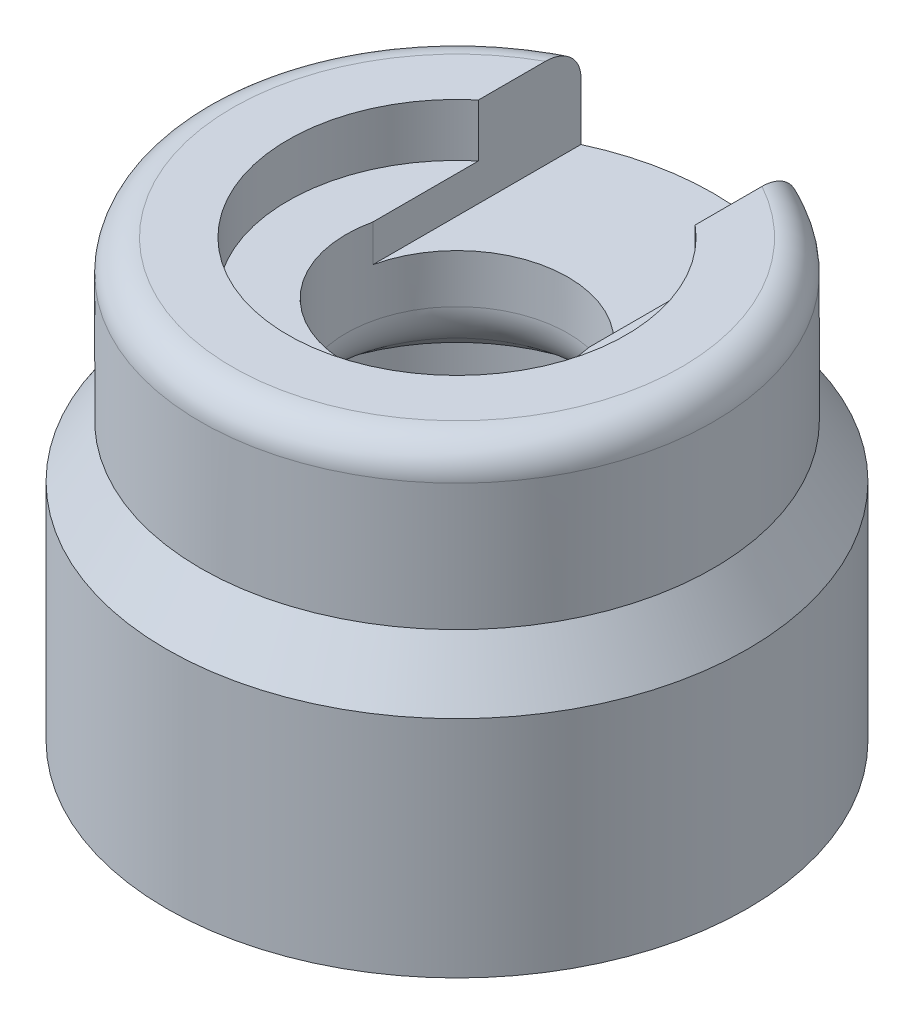
ISO-10303-21;
HEADER;
FILE_DESCRIPTION(('STEP AP214'),'2;1');
FILE_NAME('part.step','',(''),(''),'','','');
FILE_SCHEMA(('AUTOMOTIVE_DESIGN { 1 0 10303 214 1 1 1 1 }'));
ENDSEC;
DATA;
#1=APPLICATION_CONTEXT('core data for automotive mechanical design processes');
#2=APPLICATION_PROTOCOL_DEFINITION('international standard','automotive_design',2000,#1);
#3=PRODUCT_CONTEXT('',#1,'mechanical');
#4=PRODUCT('Part','Part','',(#3));
#5=PRODUCT_RELATED_PRODUCT_CATEGORY('part','',(#4));
#6=PRODUCT_DEFINITION_FORMATION('','',#4);
#7=PRODUCT_DEFINITION_CONTEXT('part definition',#1,'design');
#8=PRODUCT_DEFINITION('design','',#6,#7);
#9=PRODUCT_DEFINITION_SHAPE('','',#8);
#10=(LENGTH_UNIT() NAMED_UNIT(*) SI_UNIT(.MILLI.,.METRE.));
#11=(NAMED_UNIT(*) PLANE_ANGLE_UNIT() SI_UNIT($,.RADIAN.));
#12=(NAMED_UNIT(*) SI_UNIT($,.STERADIAN.) SOLID_ANGLE_UNIT());
#13=UNCERTAINTY_MEASURE_WITH_UNIT(LENGTH_MEASURE(1.E-05),#10,'distance_accuracy_value','');
#14=(GEOMETRIC_REPRESENTATION_CONTEXT(3) GLOBAL_UNCERTAINTY_ASSIGNED_CONTEXT((#13)) GLOBAL_UNIT_ASSIGNED_CONTEXT((#10,
#11,#12)) REPRESENTATION_CONTEXT('',''));
#15=CARTESIAN_POINT('',(0.,0.,0.));
#16=DIRECTION('',(0.,0.,1.));
#17=DIRECTION('',(1.,0.,0.));
#18=AXIS2_PLACEMENT_3D('',#15,#16,#17);
#19=CARTESIAN_POINT('',(0.,0.,0.));
#20=DIRECTION('',(0.,-1.,0.));
#21=DIRECTION('',(0.,0.,-1.));
#22=AXIS2_PLACEMENT_3D('',#19,#20,#21);
#23=CYLINDRICAL_SURFACE('',#22,2.1);
#24=CARTESIAN_POINT('',(0.,5.63062484748657,0.));
#25=DIRECTION('',(0.,1.,0.));
#26=DIRECTION('',(0.,0.,1.));
#27=AXIS2_PLACEMENT_3D('',#24,#25,#26);
#28=CIRCLE('',#27,2.1);
#29=CARTESIAN_POINT('',(0.,5.63062484748657,2.1));
#30=VERTEX_POINT('',#29);
#31=EDGE_CURVE('E152',#30,#30,#28,.F.);
#32=ORIENTED_EDGE('',*,*,#31,.T.);
#33=EDGE_LOOP('',(#32));
#34=FACE_BOUND('',#33,.T.);
#35=DIRECTION('',(0.,-1.,0.));
#36=VECTOR('',#35,1.);
#37=CARTESIAN_POINT('',(-2.05,0.,-0.455521678957217));
#38=LINE('',#37,#36);
#39=CARTESIAN_POINT('',(-2.05,7.25,-0.455521678957217));
#40=VERTEX_POINT('',#39);
#41=CARTESIAN_POINT('',(-2.05,6.55,-0.455521678957217));
#42=VERTEX_POINT('',#41);
#43=EDGE_CURVE('E107',#40,#42,#38,.T.);
#44=ORIENTED_EDGE('',*,*,#43,.F.);
#45=CARTESIAN_POINT('',(0.,7.25,0.));
#46=DIRECTION('',(0.,1.,0.));
#47=DIRECTION('',(0.,0.,1.));
#48=AXIS2_PLACEMENT_3D('',#45,#46,#47);
#49=CIRCLE('',#48,2.1);
#50=CARTESIAN_POINT('',(2.05,7.25,-0.455521678957217));
#51=VERTEX_POINT('',#50);
#52=EDGE_CURVE('E137',#51,#40,#49,.F.);
#53=ORIENTED_EDGE('',*,*,#52,.F.);
#54=DIRECTION('',(0.,-1.,0.));
#55=VECTOR('',#54,1.);
#56=CARTESIAN_POINT('',(2.05,0.,-0.455521678957217));
#57=LINE('',#56,#55);
#58=CARTESIAN_POINT('',(2.05,6.55,-0.455521678957217));
#59=VERTEX_POINT('',#58);
#60=EDGE_CURVE('E287',#59,#51,#57,.F.);
#61=ORIENTED_EDGE('',*,*,#60,.F.);
#62=CARTESIAN_POINT('',(0.,6.55,0.));
#63=DIRECTION('',(0.,-1.,0.));
#64=DIRECTION('',(0.,0.,-1.));
#65=AXIS2_PLACEMENT_3D('',#62,#63,#64);
#66=CIRCLE('',#65,2.1);
#67=EDGE_CURVE('E242',#59,#42,#66,.F.);
#68=ORIENTED_EDGE('',*,*,#67,.T.);
#69=EDGE_LOOP('',(#44,#53,#61,#68));
#70=FACE_BOUND('',#69,.T.);
#71=ADVANCED_FACE('F39',(#34,#70),#23,.F.);
#72=CARTESIAN_POINT('',(0.,8.25,0.));
#73=DIRECTION('',(0.,1.,0.));
#74=DIRECTION('',(0.,0.,1.));
#75=AXIS2_PLACEMENT_3D('',#72,#73,#74);
#76=PLANE('',#75);
#77=CARTESIAN_POINT('',(0.,8.25,0.));
#78=DIRECTION('',(0.,1.,0.));
#79=DIRECTION('',(0.,0.,1.));
#80=AXIS2_PLACEMENT_3D('',#77,#78,#79);
#81=CIRCLE('',#80,3.2);
#82=CARTESIAN_POINT('',(-2.05,8.25,-2.45713247506112));
#83=VERTEX_POINT('',#82);
#84=CARTESIAN_POINT('',(2.05,8.25,-2.45713247506112));
#85=VERTEX_POINT('',#84);
#86=EDGE_CURVE('E116',#83,#85,#81,.T.);
#87=ORIENTED_EDGE('',*,*,#86,.F.);
#88=DIRECTION('',(0.,0.,1.));
#89=VECTOR('',#88,1.);
#90=CARTESIAN_POINT('',(-2.05,8.25,-0.00307043052494294));
#91=LINE('',#90,#89);
#92=CARTESIAN_POINT('',(-2.05,8.25,-3.72290209379726));
#93=VERTEX_POINT('',#92);
#94=EDGE_CURVE('E100',#93,#83,#91,.T.);
#95=ORIENTED_EDGE('',*,*,#94,.F.);
#96=CARTESIAN_POINT('',(0.,8.25,0.));
#97=DIRECTION('',(0.,1.,0.));
#98=DIRECTION('',(0.,0.,1.));
#99=AXIS2_PLACEMENT_3D('',#96,#97,#98);
#100=CIRCLE('',#99,4.25);
#101=CARTESIAN_POINT('',(2.05,8.25,-3.72290209379726));
#102=VERTEX_POINT('',#101);
#103=EDGE_CURVE('E114',#93,#102,#100,.T.);
#104=ORIENTED_EDGE('',*,*,#103,.T.);
#105=DIRECTION('',(0.,0.,-1.));
#106=VECTOR('',#105,1.);
#107=CARTESIAN_POINT('',(2.05,8.25,-0.00307043052494294));
#108=LINE('',#107,#106);
#109=EDGE_CURVE('E118',#85,#102,#108,.T.);
#110=ORIENTED_EDGE('',*,*,#109,.F.);
#111=EDGE_LOOP('',(#87,#95,#104,#110));
#112=FACE_BOUND('',#111,.T.);
#113=ADVANCED_FACE('F112',(#112),#76,.T.);
#114=CARTESIAN_POINT('',(0.,8.25,0.));
#115=DIRECTION('',(0.,-1.,0.));
#116=DIRECTION('',(0.,0.,-1.));
#117=AXIS2_PLACEMENT_3D('',#114,#115,#116);
#118=CYLINDRICAL_SURFACE('',#117,4.85);
#119=CARTESIAN_POINT('',(0.,5.25,0.));
#120=DIRECTION('',(0.,1.,0.));
#121=DIRECTION('',(0.,0.,1.));
#122=AXIS2_PLACEMENT_3D('',#119,#120,#121);
#123=CIRCLE('',#122,4.85);
#124=CARTESIAN_POINT('',(0.,5.25,4.85));
#125=VERTEX_POINT('',#124);
#126=EDGE_CURVE('E141',#125,#125,#123,.T.);
#127=ORIENTED_EDGE('',*,*,#126,.T.);
#128=EDGE_LOOP('',(#127));
#129=FACE_BOUND('',#128,.T.);
#130=DIRECTION('',(0.,-1.,0.));
#131=VECTOR('',#130,1.);
#132=CARTESIAN_POINT('',(-2.05,8.25,-4.39545219516718));
#133=LINE('',#132,#131);
#134=CARTESIAN_POINT('',(-2.05,6.55,-4.39545219516718));
#135=VERTEX_POINT('',#134);
#136=CARTESIAN_POINT('',(-2.05,7.65,-4.39545219516718));
#137=VERTEX_POINT('',#136);
#138=EDGE_CURVE('E63',#135,#137,#133,.F.);
#139=ORIENTED_EDGE('',*,*,#138,.F.);
#140=CARTESIAN_POINT('',(0.,6.55,0.));
#141=DIRECTION('',(0.,-1.,0.));
#142=DIRECTION('',(0.,0.,-1.));
#143=AXIS2_PLACEMENT_3D('',#140,#141,#142);
#144=CIRCLE('',#143,4.85);
#145=CARTESIAN_POINT('',(2.05,6.55,-4.39545219516718));
#146=VERTEX_POINT('',#145);
#147=EDGE_CURVE('E148',#135,#146,#144,.T.);
#148=ORIENTED_EDGE('',*,*,#147,.T.);
#149=DIRECTION('',(0.,-1.,0.));
#150=VECTOR('',#149,1.);
#151=CARTESIAN_POINT('',(2.05,8.25,-4.39545219516718));
#152=LINE('',#151,#150);
#153=CARTESIAN_POINT('',(2.05,7.65000000000141,-4.39545219517171));
#154=VERTEX_POINT('',#153);
#155=EDGE_CURVE('E290',#154,#146,#152,.T.);
#156=ORIENTED_EDGE('',*,*,#155,.F.);
#157=CARTESIAN_POINT('',(0.,7.65,0.));
#158=DIRECTION('',(0.,1.,0.));
#159=DIRECTION('',(0.,0.,1.));
#160=AXIS2_PLACEMENT_3D('',#157,#158,#159);
#161=CIRCLE('',#160,4.85);
#162=EDGE_CURVE('E125',#154,#137,#161,.F.);
#163=ORIENTED_EDGE('',*,*,#162,.T.);
#164=EDGE_LOOP('',(#139,#148,#156,#163));
#165=FACE_BOUND('',#164,.T.);
#166=ADVANCED_FACE('F181',(#129,#165),#118,.T.);
#167=CARTESIAN_POINT('',(0.,7.65,0.));
#168=DIRECTION('',(0.,1.,0.));
#169=DIRECTION('',(0.,0.,1.));
#170=AXIS2_PLACEMENT_3D('',#167,#168,#169);
#171=TOROIDAL_SURFACE('',#170,4.25,0.6);
#172=ORIENTED_EDGE('',*,*,#103,.F.);
#173=CARTESIAN_POINT('',(-2.05,7.82702656765355,-4.3659624204099));
#174=CARTESIAN_POINT('',(-2.05,7.79789616420382,-4.37589958519883));
#175=CARTESIAN_POINT('',(-2.05,7.7679347321462,-4.38341858156068));
#176=CARTESIAN_POINT('',(-2.05,7.70716617375585,-4.39331166687076));
#177=CARTESIAN_POINT('',(-2.05,7.67635890080707,-4.39568485808263));
#178=CARTESIAN_POINT('',(-2.05,7.61478308067573,-4.39518345726772));
#179=CARTESIAN_POINT('',(-2.05,7.58401453883898,-4.39230820655039));
#180=CARTESIAN_POINT('',(-2.05,7.52340193468848,-4.38143035030518));
#181=CARTESIAN_POINT('',(-2.05,7.49355787578409,-4.37342772587065));
#182=CARTESIAN_POINT('',(-2.05,7.43557905794428,-4.35261248719747));
#183=CARTESIAN_POINT('',(-2.05,7.4074456215855,-4.33979620484376));
#184=CARTESIAN_POINT('',(-2.05,7.35359202055706,-4.30983848154537));
#185=CARTESIAN_POINT('',(-2.05,7.32787221595421,-4.29269639667799));
#186=CARTESIAN_POINT('',(-2.05,7.27816405898177,-4.2537183090096));
#187=CARTESIAN_POINT('',(-2.05,7.25432636381237,-4.23169061442462));
#188=CARTESIAN_POINT('',(-2.05,7.21032616660067,-4.18423574651145));
#189=CARTESIAN_POINT('',(-2.05,7.19016486124239,-4.15880747092846));
#190=CARTESIAN_POINT('',(-2.05,7.1521909904352,-4.10292509906765));
#191=CARTESIAN_POINT('',(-2.05,7.13473973763256,-4.07222578945374));
#192=CARTESIAN_POINT('',(-2.05,7.10467810415964,-4.00854754961368));
#193=CARTESIAN_POINT('',(-2.05,7.09206973737342,-3.97556767774238));
#194=CARTESIAN_POINT('',(-2.05,7.07066861067594,-3.9045792712337));
#195=CARTESIAN_POINT('',(-2.05,7.06241825476747,-3.86640714494793));
#196=CARTESIAN_POINT('',(-2.05,7.05183749056033,-3.78925367539485));
#197=CARTESIAN_POINT('',(-2.05,7.0495094947644,-3.75027200887392));
#198=CARTESIAN_POINT('',(-2.05,7.05071588732587,-3.6687219188476));
#199=CARTESIAN_POINT('',(-2.05,7.05482278012077,-3.6261612997214));
#200=CARTESIAN_POINT('',(-2.05,7.06981696602189,-3.54222647356126));
#201=CARTESIAN_POINT('',(-2.05,7.08070885536849,-3.50085309066589));
#202=CARTESIAN_POINT('',(-2.05,7.10969160320318,-3.41874697533617));
#203=CARTESIAN_POINT('',(-2.05,7.12806330977758,-3.37811263590838));
#204=CARTESIAN_POINT('',(-2.05,7.17176396920776,-3.30077634383149));
#205=CARTESIAN_POINT('',(-2.05,7.19708547483925,-3.26407023997886));
#206=CARTESIAN_POINT('',(-2.05,7.24801957741552,-3.20373637431564));
#207=CARTESIAN_POINT('',(-2.05,7.27233395711084,-3.17901028512039));
#208=CARTESIAN_POINT('',(-2.05,7.32470733103949,-3.13387637278035));
#209=CARTESIAN_POINT('',(-2.05,7.35276444311836,-3.11346639239095));
#210=CARTESIAN_POINT('',(-2.05,7.41234971583042,-3.07786335533166));
#211=CARTESIAN_POINT('',(-2.05,7.44390341388455,-3.06271254328679));
#212=CARTESIAN_POINT('',(-2.05,7.50937765377983,-3.03891481103632));
#213=CARTESIAN_POINT('',(-2.05,7.5432955525543,-3.03026075127402));
#214=CARTESIAN_POINT('',(-2.05,7.60742884776183,-3.02085772894982));
#215=CARTESIAN_POINT('',(-2.05,7.63751048299831,-3.01918386797632));
#216=CARTESIAN_POINT('',(-2.05,7.6974752822644,-3.02130020750095));
#217=CARTESIAN_POINT('',(-2.05,7.72735850860811,-3.02508860215133));
#218=CARTESIAN_POINT('',(-2.05,7.7840594118198,-3.03745077956584));
#219=CARTESIAN_POINT('',(-2.05,7.81094997157599,-3.04569672945288));
#220=CARTESIAN_POINT('',(-2.05,7.86309971812131,-3.06629617782491));
#221=CARTESIAN_POINT('',(-2.05,7.88835861053544,-3.07865041504282));
#222=CARTESIAN_POINT('',(-2.05,7.93847488659082,-3.10791279131869));
#223=CARTESIAN_POINT('',(-2.05,7.96318090363088,-3.1250788031759));
#224=CARTESIAN_POINT('',(-2.05,8.00983739260526,-3.16280725584708));
#225=CARTESIAN_POINT('',(-2.05,8.03178653735467,-3.18337132157021));
#226=CARTESIAN_POINT('',(-2.05,8.0757708215901,-3.23054659082279));
#227=CARTESIAN_POINT('',(-2.05,8.09732884043481,-3.25760223855464));
#228=CARTESIAN_POINT('',(-2.05,8.13632888681062,-3.31452887400689));
#229=CARTESIAN_POINT('',(-2.05,8.15376847838147,-3.34440151337395));
#230=CARTESIAN_POINT('',(-2.05,8.18681520332177,-3.41110286884268));
#231=CARTESIAN_POINT('',(-2.05,8.20170579942668,-3.44828769849733));
#232=CARTESIAN_POINT('',(-2.05,8.22566473847258,-3.52449255936302));
#233=CARTESIAN_POINT('',(-2.05,8.23472998466301,-3.56351355486919));
#234=CARTESIAN_POINT('',(-2.05,8.24747375800465,-3.64631759223002));
#235=CARTESIAN_POINT('',(-2.05,8.25054509319164,-3.69019564533298));
#236=CARTESIAN_POINT('',(-2.05,8.24929645733402,-3.77786178903724));
#237=CARTESIAN_POINT('',(-2.05,8.24497509273001,-3.8216498611188));
#238=CARTESIAN_POINT('',(-2.05,8.22878540960025,-3.90784001113535));
#239=CARTESIAN_POINT('',(-2.05,8.21691523726177,-3.95024174592789));
#240=CARTESIAN_POINT('',(-2.05,8.18559209233744,-4.03217134846679));
#241=CARTESIAN_POINT('',(-2.05,8.16614141255357,-4.07170008089689));
#242=CARTESIAN_POINT('',(-2.05,8.12178987967923,-4.14316566859015));
#243=CARTESIAN_POINT('',(-2.05,8.09746497552256,-4.17545903998858));
#244=CARTESIAN_POINT('',(-2.05,8.04310817933888,-4.23479624131825));
#245=CARTESIAN_POINT('',(-2.05,8.01308602534007,-4.26184887182379));
#246=CARTESIAN_POINT('',(-2.05,7.9572485946442,-4.30273543456146));
#247=CARTESIAN_POINT('',(-2.05,7.93258099963404,-4.3181538716295));
#248=CARTESIAN_POINT('',(-2.05,7.88119660508023,-4.3450838961169));
#249=CARTESIAN_POINT('',(-2.05,7.85448065488254,-4.35659709220924));
#250=CARTESIAN_POINT('',(-2.05,7.82702656765355,-4.3659624204099));
#251=B_SPLINE_CURVE_WITH_KNOTS('',3,(#173,#174,#175,#176,#177,#178,#179,#180,#181,#182,#183,
#184,#185,#186,#187,#188,#189,#190,#191,#192,#193,#194,#195,#196,#197,#198,#199,#200,#201,#202,
#203,#204,#205,#206,#207,#208,#209,#210,#211,#212,#213,#214,#215,#216,#217,#218,#219,#220,#221,
#222,#223,#224,#225,#226,#227,#228,#229,#230,#231,#232,#233,#234,#235,#236,#237,#238,#239,#240,
#241,#242,#243,#244,#245,#246,#247,#248,#249,#250),.UNSPECIFIED.,.T.,.F.,(4,2,2,2,2,2,2,2,2,2,2,
2,2,2,2,2,2,2,2,2,2,2,2,2,2,2,2,2,2,2,2,2,2,2,2,2,2,2,4),(0.,0.0922353657705963,
0.184486821614483,0.276749856006947,0.369013230611486,0.46134705508787,0.55369463214644,
0.650654974637119,0.747646822103546,0.853149167204813,0.958695337424861,1.0753688565956,
1.19208989569759,1.3197988330454,1.44759437622078,1.58071068286834,1.71368489873564,
1.81730473615466,1.92087266004515,2.02525422916093,2.12952092034462,2.21942142614593,
2.30929221722536,2.39330818307341,2.47733926445436,2.56724168075667,2.65718721240428,
2.76057137692834,2.86401653863454,2.98368804723432,3.10342312058244,3.23476219466188,
3.36612602951566,3.49752213675523,3.6288785327029,3.74949034689628,3.86989783244441,
3.95686135766385,4.04378901665884),.UNSPECIFIED.);
#252=EDGE_CURVE('E97',#93,#137,#251,.T.);
#253=ORIENTED_EDGE('',*,*,#252,.T.);
#254=ORIENTED_EDGE('',*,*,#162,.F.);
#255=CARTESIAN_POINT('',(2.05,7.82702656765355,-4.3659624204099));
#256=CARTESIAN_POINT('',(2.05,7.85845116373127,-4.35524020156051));
#257=CARTESIAN_POINT('',(2.05,7.88893845091345,-4.34169321240446));
#258=CARTESIAN_POINT('',(2.05,7.94714299271204,-4.30953875746112));
#259=CARTESIAN_POINT('',(2.05,7.97485594961202,-4.29092360154361));
#260=CARTESIAN_POINT('',(2.05,8.02671756652584,-4.24945701674648));
#261=CARTESIAN_POINT('',(2.05,8.0508795173142,-4.22662214600511));
#262=CARTESIAN_POINT('',(2.05,8.09530863566426,-4.17746104492432));
#263=CARTESIAN_POINT('',(2.05,8.11557635027492,-4.15113530584955));
#264=CARTESIAN_POINT('',(2.05,8.15316965912072,-4.09391129103401));
#265=CARTESIAN_POINT('',(2.05,8.17020849778071,-4.06282508227916));
#266=CARTESIAN_POINT('',(2.05,8.19939880287093,-3.99844071247992));
#267=CARTESIAN_POINT('',(2.05,8.2115481256459,-3.96514158869005));
#268=CARTESIAN_POINT('',(2.05,8.23195568945314,-3.8935105162487));
#269=CARTESIAN_POINT('',(2.05,8.23966023996694,-3.85502073391044));
#270=CARTESIAN_POINT('',(2.05,8.24909860517074,-3.77731784681239));
#271=CARTESIAN_POINT('',(2.05,8.25082993862605,-3.73810444826529));
#272=CARTESIAN_POINT('',(2.05,8.24832825530129,-3.65622876947952));
#273=CARTESIAN_POINT('',(2.05,8.24352851931522,-3.61358311034281));
#274=CARTESIAN_POINT('',(2.05,8.22711678111371,-3.52959665990672));
#275=CARTESIAN_POINT('',(2.05,8.2155001644249,-3.48825677250346));
#276=CARTESIAN_POINT('',(2.05,8.18506654930002,-3.40651943516512));
#277=CARTESIAN_POINT('',(2.05,8.16599485281074,-3.3662161134218));
#278=CARTESIAN_POINT('',(2.05,8.12092128162532,-3.28969304730218));
#279=CARTESIAN_POINT('',(2.05,8.09492740134261,-3.25346866040708));
#280=CARTESIAN_POINT('',(2.05,8.04306821630167,-3.19441327883802));
#281=CARTESIAN_POINT('',(2.05,8.01853091975604,-3.17041330156966));
#282=CARTESIAN_POINT('',(2.05,7.96583405362623,-3.1267605753272));
#283=CARTESIAN_POINT('',(2.05,7.93767645117678,-3.1071054811676));
#284=CARTESIAN_POINT('',(2.05,7.87803453389167,-3.07302342075311));
#285=CARTESIAN_POINT('',(2.05,7.84652627979598,-3.05863786312627));
#286=CARTESIAN_POINT('',(2.05,7.78129862384408,-3.03632152240065));
#287=CARTESIAN_POINT('',(2.05,7.74758155114276,-3.02838405464636));
#288=CARTESIAN_POINT('',(2.05,7.68384766224499,-3.02019618700633));
#289=CARTESIAN_POINT('',(2.05,7.65394336373204,-3.01905520690333));
#290=CARTESIAN_POINT('',(2.05,7.5944207986256,-3.02215564006646));
#291=CARTESIAN_POINT('',(2.05,7.56480245275124,-3.02639551562656));
#292=CARTESIAN_POINT('',(2.05,7.50847570039741,-3.03957444071362));
#293=CARTESIAN_POINT('',(2.05,7.4816984009286,-3.04822429349773));
#294=CARTESIAN_POINT('',(2.05,7.42982675650259,-3.06958827697445));
#295=CARTESIAN_POINT('',(2.05,7.4047327402929,-3.08230319880087));
#296=CARTESIAN_POINT('',(2.05,7.35487061566852,-3.11233643319897));
#297=CARTESIAN_POINT('',(2.05,7.33026827950996,-3.12992859416607));
#298=CARTESIAN_POINT('',(2.05,7.28387400414938,-3.16848393771036));
#299=CARTESIAN_POINT('',(2.05,7.26208344866614,-3.18944876871293));
#300=CARTESIAN_POINT('',(2.05,7.21845216698128,-3.23749757120448));
#301=CARTESIAN_POINT('',(2.05,7.19710285338653,-3.2650274420099));
#302=CARTESIAN_POINT('',(2.05,7.15859139070635,-3.32287070701234));
#303=CARTESIAN_POINT('',(2.05,7.14143171608565,-3.3531857316884));
#304=CARTESIAN_POINT('',(2.05,7.10908496841692,-3.42075821486627));
#305=CARTESIAN_POINT('',(2.05,7.09461943503448,-3.4583622394865));
#306=CARTESIAN_POINT('',(2.05,7.07159240315678,-3.53534162202768));
#307=CARTESIAN_POINT('',(2.05,7.06303400575422,-3.57471789879883));
#308=CARTESIAN_POINT('',(2.05,7.05146422760089,-3.65802695582652));
#309=CARTESIAN_POINT('',(2.05,7.04904223487013,-3.70204312150773));
#310=CARTESIAN_POINT('',(2.05,7.05163873361001,-3.78987195899608));
#311=CARTESIAN_POINT('',(2.05,7.05665858569869,-3.8336845921214));
#312=CARTESIAN_POINT('',(2.05,7.07424937263967,-3.91959904185789));
#313=CARTESIAN_POINT('',(2.05,7.08678897347214,-3.96170718792121));
#314=CARTESIAN_POINT('',(2.05,7.119406404558,-4.04291265590448));
#315=CARTESIAN_POINT('',(2.05,7.13948057539639,-4.08201142833606));
#316=CARTESIAN_POINT('',(2.05,7.18488984509428,-4.15241508649382));
#317=CARTESIAN_POINT('',(2.05,7.20963431566199,-4.18409975274613));
#318=CARTESIAN_POINT('',(2.05,7.26471743793169,-4.24217020659645));
#319=CARTESIAN_POINT('',(2.05,7.29505099099812,-4.26856077826198));
#320=CARTESIAN_POINT('',(2.05,7.35664167101933,-4.31202756728279));
#321=CARTESIAN_POINT('',(2.05,7.38738887205065,-4.32982696478281));
#322=CARTESIAN_POINT('',(2.05,7.4516677386573,-4.35939120210024));
#323=CARTESIAN_POINT('',(2.05,7.48519801843257,-4.37115902456899));
#324=CARTESIAN_POINT('',(2.05,7.55066695021303,-4.38726542023047));
#325=CARTESIAN_POINT('',(2.05,7.58246127302796,-4.3921957691988));
#326=CARTESIAN_POINT('',(2.05,7.64639579957142,-4.3963795532946));
#327=CARTESIAN_POINT('',(2.05,7.67853547007073,-4.39564075258471));
#328=CARTESIAN_POINT('',(2.05,7.73018939808997,-4.389883043448));
#329=CARTESIAN_POINT('',(2.05,7.74991107839011,-4.38657620794004));
#330=CARTESIAN_POINT('',(2.05,7.78887708917716,-4.37784109432971));
#331=CARTESIAN_POINT('',(2.05,7.80812144654215,-4.37241293596878));
#332=CARTESIAN_POINT('',(2.05,7.82702656765355,-4.3659624204099));
#333=B_SPLINE_CURVE_WITH_KNOTS('',3,(#255,#256,#257,#258,#259,#260,#261,#262,#263,#264,#265,
#266,#267,#268,#269,#270,#271,#272,#273,#274,#275,#276,#277,#278,#279,#280,#281,#282,#283,#284,
#285,#286,#287,#288,#289,#290,#291,#292,#293,#294,#295,#296,#297,#298,#299,#300,#301,#302,#303,
#304,#305,#306,#307,#308,#309,#310,#311,#312,#313,#314,#315,#316,#317,#318,#319,#320,#321,#322,
#323,#324,#325,#326,#327,#328,#329,#330,#331,#332),.UNSPECIFIED.,.T.,.F.,(4,2,2,2,2,2,2,2,2,2,2,
2,2,2,2,2,2,2,2,2,2,2,2,2,2,2,2,2,2,2,2,2,2,2,2,2,2,2,4),(0.,0.0995308203242557,
0.199213512572741,0.298513050928757,0.397798629811365,0.503712663181936,0.609673080794233,
0.726942635310498,0.844260896959345,0.97243488889735,1.1006957444432,1.23378705062751,
1.36672531161533,1.46928504472602,1.57178928449317,1.67508256027545,1.77826861604308,
1.86757130790554,1.95684848516962,2.04090663973254,2.12498116345635,2.21536487961419,
2.30579290666426,2.4099051924268,2.51407882055113,2.63444966479959,2.75488365264456,
2.88650946251729,3.01815934095698,3.14926442299703,3.28030591170836,3.40023285279783,
3.52005092748581,3.62605124158581,3.73199908717631,3.82804044012764,3.92395028350435,
3.98383167102745,4.04370967893863),.UNSPECIFIED.);
#334=EDGE_CURVE('E123',#154,#102,#333,.T.);
#335=ORIENTED_EDGE('',*,*,#334,.T.);
#336=EDGE_LOOP('',(#172,#253,#254,#335));
#337=FACE_BOUND('',#336,.T.);
#338=ADVANCED_FACE('F122',(#337),#171,.T.);
#339=CARTESIAN_POINT('',(0.,7.25,0.));
#340=DIRECTION('',(0.,1.,0.));
#341=DIRECTION('',(0.,0.,1.));
#342=AXIS2_PLACEMENT_3D('',#339,#340,#341);
#343=PLANE('',#342);
#344=ORIENTED_EDGE('',*,*,#52,.T.);
#345=DIRECTION('',(0.,0.,-1.));
#346=VECTOR('',#345,1.);
#347=CARTESIAN_POINT('',(-2.05,7.25,0.));
#348=LINE('',#347,#346);
#349=CARTESIAN_POINT('',(-2.05,7.25,-2.45713247506112));
#350=VERTEX_POINT('',#349);
#351=EDGE_CURVE('E292',#40,#350,#348,.T.);
#352=ORIENTED_EDGE('',*,*,#351,.T.);
#353=CARTESIAN_POINT('',(0.,7.25,0.));
#354=DIRECTION('',(0.,1.,0.));
#355=DIRECTION('',(0.,0.,1.));
#356=AXIS2_PLACEMENT_3D('',#353,#354,#355);
#357=CIRCLE('',#356,3.2);
#358=CARTESIAN_POINT('',(2.05,7.25,-2.45713247506112));
#359=VERTEX_POINT('',#358);
#360=EDGE_CURVE('E142',#350,#359,#357,.T.);
#361=ORIENTED_EDGE('',*,*,#360,.T.);
#362=DIRECTION('',(0.,0.,1.));
#363=VECTOR('',#362,1.);
#364=CARTESIAN_POINT('',(2.05,7.25,0.));
#365=LINE('',#364,#363);
#366=EDGE_CURVE('E55',#359,#51,#365,.T.);
#367=ORIENTED_EDGE('',*,*,#366,.T.);
#368=EDGE_LOOP('',(#344,#352,#361,#367));
#369=FACE_BOUND('',#368,.T.);
#370=ADVANCED_FACE('F205',(#369),#343,.T.);
#371=CARTESIAN_POINT('',(0.,7.25,0.));
#372=DIRECTION('',(0.,1.,0.));
#373=DIRECTION('',(0.,0.,1.));
#374=AXIS2_PLACEMENT_3D('',#371,#372,#373);
#375=CYLINDRICAL_SURFACE('',#374,3.2);
#376=DIRECTION('',(0.,1.,0.));
#377=VECTOR('',#376,1.);
#378=CARTESIAN_POINT('',(-2.05,7.25,-2.45713247506112));
#379=LINE('',#378,#377);
#380=EDGE_CURVE('E145',#83,#350,#379,.F.);
#381=ORIENTED_EDGE('',*,*,#380,.F.);
#382=ORIENTED_EDGE('',*,*,#86,.T.);
#383=DIRECTION('',(0.,1.,0.));
#384=VECTOR('',#383,1.);
#385=CARTESIAN_POINT('',(2.05,7.25,-2.45713247506112));
#386=LINE('',#385,#384);
#387=EDGE_CURVE('E130',#359,#85,#386,.T.);
#388=ORIENTED_EDGE('',*,*,#387,.F.);
#389=ORIENTED_EDGE('',*,*,#360,.F.);
#390=EDGE_LOOP('',(#381,#382,#388,#389));
#391=FACE_BOUND('',#390,.T.);
#392=ADVANCED_FACE('F199',(#391),#375,.F.);
#393=CARTESIAN_POINT('',(0.,0.,0.));
#394=DIRECTION('',(0.,1.,0.));
#395=DIRECTION('',(0.,0.,1.));
#396=AXIS2_PLACEMENT_3D('',#393,#394,#395);
#397=PLANE('',#396);
#398=CARTESIAN_POINT('',(0.,0.,0.));
#399=DIRECTION('',(0.,1.,0.));
#400=DIRECTION('',(0.,0.,1.));
#401=AXIS2_PLACEMENT_3D('',#398,#399,#400);
#402=CIRCLE('',#401,3.975);
#403=CARTESIAN_POINT('',(0.,0.,3.975));
#404=VERTEX_POINT('',#403);
#405=EDGE_CURVE('E48',#404,#404,#402,.T.);
#406=ORIENTED_EDGE('',*,*,#405,.T.);
#407=EDGE_LOOP('',(#406));
#408=FACE_BOUND('',#407,.T.);
#409=CARTESIAN_POINT('',(0.,0.,0.));
#410=DIRECTION('',(0.,1.,0.));
#411=DIRECTION('',(0.,0.,1.));
#412=AXIS2_PLACEMENT_3D('',#409,#410,#411);
#413=CIRCLE('',#412,5.5);
#414=CARTESIAN_POINT('',(0.,0.,5.5));
#415=VERTEX_POINT('',#414);
#416=EDGE_CURVE('E133',#415,#415,#413,.T.);
#417=ORIENTED_EDGE('',*,*,#416,.F.);
#418=EDGE_LOOP('',(#417));
#419=FACE_BOUND('',#418,.T.);
#420=ADVANCED_FACE('F163',(#408,#419),#397,.F.);
#421=CARTESIAN_POINT('',(0.,4.25,0.));
#422=DIRECTION('',(0.,-1.,0.));
#423=DIRECTION('',(0.,0.,-1.));
#424=AXIS2_PLACEMENT_3D('',#421,#422,#423);
#425=CYLINDRICAL_SURFACE('',#424,5.5);
#426=CARTESIAN_POINT('',(0.,4.25,0.));
#427=DIRECTION('',(0.,1.,0.));
#428=DIRECTION('',(0.,0.,1.));
#429=AXIS2_PLACEMENT_3D('',#426,#427,#428);
#430=CIRCLE('',#429,5.5);
#431=CARTESIAN_POINT('',(0.,4.25,5.5));
#432=VERTEX_POINT('',#431);
#433=EDGE_CURVE('E126',#432,#432,#430,.T.);
#434=ORIENTED_EDGE('',*,*,#433,.F.);
#435=EDGE_LOOP('',(#434));
#436=FACE_BOUND('',#435,.T.);
#437=ORIENTED_EDGE('',*,*,#416,.T.);
#438=EDGE_LOOP('',(#437));
#439=FACE_BOUND('',#438,.T.);
#440=ADVANCED_FACE('F195',(#436,#439),#425,.T.);
#441=CARTESIAN_POINT('',(0.,4.25,0.));
#442=DIRECTION('',(0.,-1.,0.));
#443=DIRECTION('',(0.,0.,-1.));
#444=AXIS2_PLACEMENT_3D('',#441,#442,#443);
#445=CYLINDRICAL_SURFACE('',#444,3.225);
#446=CARTESIAN_POINT('',(0.,0.75,0.));
#447=DIRECTION('',(0.,1.,0.));
#448=DIRECTION('',(0.,0.,1.));
#449=AXIS2_PLACEMENT_3D('',#446,#447,#448);
#450=CIRCLE('',#449,3.225);
#451=CARTESIAN_POINT('',(0.,0.75,3.225));
#452=VERTEX_POINT('',#451);
#453=EDGE_CURVE('E11',#452,#452,#450,.F.);
#454=ORIENTED_EDGE('',*,*,#453,.T.);
#455=EDGE_LOOP('',(#454));
#456=FACE_BOUND('',#455,.T.);
#457=CARTESIAN_POINT('',(0.,4.25,0.));
#458=DIRECTION('',(0.,-1.,0.));
#459=DIRECTION('',(0.,0.,-1.));
#460=AXIS2_PLACEMENT_3D('',#457,#458,#459);
#461=CIRCLE('',#460,3.225);
#462=CARTESIAN_POINT('',(0.,4.25,-3.225));
#463=VERTEX_POINT('',#462);
#464=EDGE_CURVE('E255',#463,#463,#461,.T.);
#465=ORIENTED_EDGE('',*,*,#464,.F.);
#466=EDGE_LOOP('',(#465));
#467=FACE_BOUND('',#466,.T.);
#468=ADVANCED_FACE('F191',(#456,#467),#445,.F.);
#469=CARTESIAN_POINT('',(0.,5.25,0.));
#470=DIRECTION('',(0.,-1.,0.));
#471=DIRECTION('',(0.,0.,-1.));
#472=AXIS2_PLACEMENT_3D('',#469,#470,#471);
#473=CONICAL_SURFACE('',#472,4.85,0.576375220591183);
#474=ORIENTED_EDGE('',*,*,#433,.T.);
#475=EDGE_LOOP('',(#474));
#476=FACE_BOUND('',#475,.T.);
#477=ORIENTED_EDGE('',*,*,#126,.F.);
#478=EDGE_LOOP('',(#477));
#479=FACE_BOUND('',#478,.T.);
#480=ADVANCED_FACE('F188',(#476,#479),#473,.T.);
#481=CARTESIAN_POINT('',(0.,4.25,0.));
#482=DIRECTION('',(0.,-1.,0.));
#483=DIRECTION('',(0.,0.,-1.));
#484=AXIS2_PLACEMENT_3D('',#481,#482,#483);
#485=CONICAL_SURFACE('',#484,3.225,0.896055384571344);
#486=CARTESIAN_POINT('',(0.,4.84975603804354,0.));
#487=DIRECTION('',(0.,1.,0.));
#488=DIRECTION('',(0.,0.,1.));
#489=AXIS2_PLACEMENT_3D('',#486,#487,#488);
#490=CIRCLE('',#489,2.47530495244558);
#491=CARTESIAN_POINT('',(0.,4.84975603804354,2.47530495244558));
#492=VERTEX_POINT('',#491);
#493=EDGE_CURVE('E156',#492,#492,#490,.T.);
#494=ORIENTED_EDGE('',*,*,#493,.T.);
#495=EDGE_LOOP('',(#494));
#496=FACE_BOUND('',#495,.T.);
#497=ORIENTED_EDGE('',*,*,#464,.T.);
#498=EDGE_LOOP('',(#497));
#499=FACE_BOUND('',#498,.T.);
#500=ADVANCED_FACE('F186',(#496,#499),#485,.F.);
#501=CARTESIAN_POINT('',(0.,6.55,0.));
#502=DIRECTION('',(0.,-1.,0.));
#503=DIRECTION('',(0.,0.,-1.));
#504=AXIS2_PLACEMENT_3D('',#501,#502,#503);
#505=PLANE('',#504);
#506=DIRECTION('',(0.,0.,-1.));
#507=VECTOR('',#506,1.);
#508=CARTESIAN_POINT('',(2.05,6.55,-0.00307043052494294));
#509=LINE('',#508,#507);
#510=EDGE_CURVE('E119',#59,#146,#509,.T.);
#511=ORIENTED_EDGE('',*,*,#510,.T.);
#512=ORIENTED_EDGE('',*,*,#147,.F.);
#513=DIRECTION('',(0.,0.,1.));
#514=VECTOR('',#513,1.);
#515=CARTESIAN_POINT('',(-2.05,6.55,-0.00307043052494294));
#516=LINE('',#515,#514);
#517=EDGE_CURVE('E280',#135,#42,#516,.T.);
#518=ORIENTED_EDGE('',*,*,#517,.T.);
#519=ORIENTED_EDGE('',*,*,#67,.F.);
#520=EDGE_LOOP('',(#511,#512,#518,#519));
#521=FACE_BOUND('',#520,.T.);
#522=ADVANCED_FACE('F225',(#521),#505,.F.);
#523=CARTESIAN_POINT('',(-2.05,8.25,-0.00307043052494294));
#524=DIRECTION('',(1.,0.,0.));
#525=DIRECTION('',(0.,0.,-1.));
#526=AXIS2_PLACEMENT_3D('',#523,#524,#525);
#527=PLANE('',#526);
#528=ORIENTED_EDGE('',*,*,#138,.T.);
#529=ORIENTED_EDGE('',*,*,#252,.F.);
#530=ORIENTED_EDGE('',*,*,#94,.T.);
#531=ORIENTED_EDGE('',*,*,#380,.T.);
#532=ORIENTED_EDGE('',*,*,#351,.F.);
#533=ORIENTED_EDGE('',*,*,#43,.T.);
#534=ORIENTED_EDGE('',*,*,#517,.F.);
#535=EDGE_LOOP('',(#528,#529,#530,#531,#532,#533,#534));
#536=FACE_BOUND('',#535,.T.);
#537=ADVANCED_FACE('F99',(#536),#527,.T.);
#538=CARTESIAN_POINT('',(2.05,8.25,-0.00307043052494294));
#539=DIRECTION('',(-1.,0.,0.));
#540=DIRECTION('',(0.,0.,1.));
#541=AXIS2_PLACEMENT_3D('',#538,#539,#540);
#542=PLANE('',#541);
#543=ORIENTED_EDGE('',*,*,#155,.T.);
#544=ORIENTED_EDGE('',*,*,#510,.F.);
#545=ORIENTED_EDGE('',*,*,#60,.T.);
#546=ORIENTED_EDGE('',*,*,#366,.F.);
#547=ORIENTED_EDGE('',*,*,#387,.T.);
#548=ORIENTED_EDGE('',*,*,#109,.T.);
#549=ORIENTED_EDGE('',*,*,#334,.F.);
#550=EDGE_LOOP('',(#543,#544,#545,#546,#547,#548,#549));
#551=FACE_BOUND('',#550,.T.);
#552=ADVANCED_FACE('F172',(#551),#542,.T.);
#553=CARTESIAN_POINT('',(0.,5.63062484748657,0.));
#554=DIRECTION('',(0.,1.,0.));
#555=DIRECTION('',(0.,0.,1.));
#556=AXIS2_PLACEMENT_3D('',#553,#554,#555);
#557=TOROIDAL_SURFACE('',#556,3.1,1.);
#558=ORIENTED_EDGE('',*,*,#493,.F.);
#559=EDGE_LOOP('',(#558));
#560=FACE_BOUND('',#559,.T.);
#561=ORIENTED_EDGE('',*,*,#31,.F.);
#562=EDGE_LOOP('',(#561));
#563=FACE_BOUND('',#562,.T.);
#564=ADVANCED_FACE('F167',(#560,#563),#557,.T.);
#565=CARTESIAN_POINT('',(0.,0.75,0.));
#566=DIRECTION('',(0.,1.,0.));
#567=DIRECTION('',(0.,0.,1.));
#568=AXIS2_PLACEMENT_3D('',#565,#566,#567);
#569=TOROIDAL_SURFACE('',#568,3.975,0.75);
#570=ORIENTED_EDGE('',*,*,#453,.F.);
#571=EDGE_LOOP('',(#570));
#572=FACE_BOUND('',#571,.T.);
#573=ORIENTED_EDGE('',*,*,#405,.F.);
#574=EDGE_LOOP('',(#573));
#575=FACE_BOUND('',#574,.T.);
#576=ADVANCED_FACE('F41',(#572,#575),#569,.T.);
#577=CLOSED_SHELL('',(#71,#113,#166,#338,#370,#392,#420,#440,#468,#480,#500,#522,#537,#552,#564,#576));
#578=MANIFOLD_SOLID_BREP('B2',#577);
#579=ADVANCED_BREP_SHAPE_REPRESENTATION('',(#18,#578),#14);
#580=SHAPE_DEFINITION_REPRESENTATION(#9,#579);
ENDSEC;
END-ISO-10303-21;
